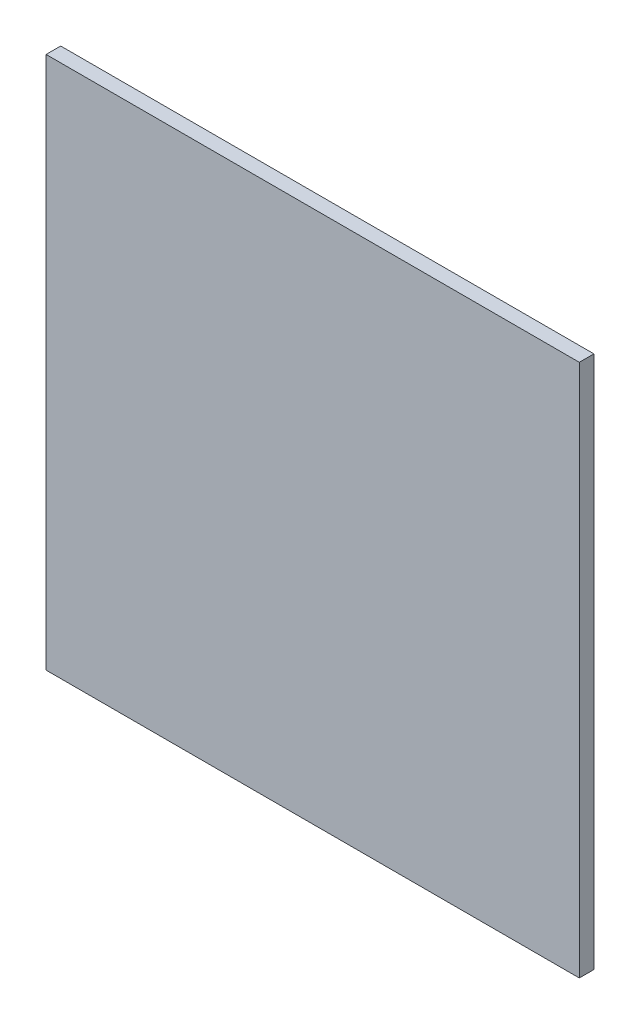
ISO-10303-21;
HEADER;
FILE_DESCRIPTION(('STEP AP214'),'2;1');
FILE_NAME('part.step','',(''),(''),'','','');
FILE_SCHEMA(('AUTOMOTIVE_DESIGN { 1 0 10303 214 1 1 1 1 }'));
ENDSEC;
DATA;
#1=APPLICATION_CONTEXT('core data for automotive mechanical design processes');
#2=APPLICATION_PROTOCOL_DEFINITION('international standard','automotive_design',2000,#1);
#3=PRODUCT_CONTEXT('',#1,'mechanical');
#4=PRODUCT('Part','Part','',(#3));
#5=PRODUCT_RELATED_PRODUCT_CATEGORY('part','',(#4));
#6=PRODUCT_DEFINITION_FORMATION('','',#4);
#7=PRODUCT_DEFINITION_CONTEXT('part definition',#1,'design');
#8=PRODUCT_DEFINITION('design','',#6,#7);
#9=PRODUCT_DEFINITION_SHAPE('','',#8);
#10=(LENGTH_UNIT() NAMED_UNIT(*) SI_UNIT(.MILLI.,.METRE.));
#11=(NAMED_UNIT(*) PLANE_ANGLE_UNIT() SI_UNIT($,.RADIAN.));
#12=(NAMED_UNIT(*) SI_UNIT($,.STERADIAN.) SOLID_ANGLE_UNIT());
#13=UNCERTAINTY_MEASURE_WITH_UNIT(LENGTH_MEASURE(1.E-05),#10,'distance_accuracy_value','');
#14=(GEOMETRIC_REPRESENTATION_CONTEXT(3) GLOBAL_UNCERTAINTY_ASSIGNED_CONTEXT((#13)) GLOBAL_UNIT_ASSIGNED_CONTEXT((#10,
#11,#12)) REPRESENTATION_CONTEXT('',''));
#15=CARTESIAN_POINT('',(0.,0.,0.));
#16=DIRECTION('',(0.,0.,1.));
#17=DIRECTION('',(1.,0.,0.));
#18=AXIS2_PLACEMENT_3D('',#15,#16,#17);
#19=CARTESIAN_POINT('',(36.5,36.5,2.));
#20=DIRECTION('',(-1.,0.,0.));
#21=DIRECTION('',(0.,-1.,0.));
#22=AXIS2_PLACEMENT_3D('',#19,#20,#21);
#23=PLANE('',#22);
#24=DIRECTION('',(0.,1.,0.));
#25=VECTOR('',#24,1.);
#26=CARTESIAN_POINT('',(36.5,36.5,0.));
#27=LINE('',#26,#25);
#28=CARTESIAN_POINT('',(36.5,-36.5,0.));
#29=VERTEX_POINT('',#28);
#30=CARTESIAN_POINT('',(36.5,36.5,0.));
#31=VERTEX_POINT('',#30);
#32=EDGE_CURVE('E96',#29,#31,#27,.T.);
#33=ORIENTED_EDGE('',*,*,#32,.T.);
#34=DIRECTION('',(0.,0.,-1.));
#35=VECTOR('',#34,1.);
#36=CARTESIAN_POINT('',(36.5,36.5,2.));
#37=LINE('',#36,#35);
#38=CARTESIAN_POINT('',(36.5,36.5,2.));
#39=VERTEX_POINT('',#38);
#40=EDGE_CURVE('E11',#39,#31,#37,.T.);
#41=ORIENTED_EDGE('',*,*,#40,.F.);
#42=DIRECTION('',(0.,1.,0.));
#43=VECTOR('',#42,1.);
#44=CARTESIAN_POINT('',(36.5,36.5,2.));
#45=LINE('',#44,#43);
#46=CARTESIAN_POINT('',(36.5,-36.5,2.));
#47=VERTEX_POINT('',#46);
#48=EDGE_CURVE('E84',#47,#39,#45,.T.);
#49=ORIENTED_EDGE('',*,*,#48,.F.);
#50=DIRECTION('',(0.,0.,-1.));
#51=VECTOR('',#50,1.);
#52=CARTESIAN_POINT('',(36.5,-36.5,2.));
#53=LINE('',#52,#51);
#54=EDGE_CURVE('E92',#47,#29,#53,.T.);
#55=ORIENTED_EDGE('',*,*,#54,.T.);
#56=EDGE_LOOP('',(#33,#41,#49,#55));
#57=FACE_BOUND('',#56,.T.);
#58=ADVANCED_FACE('F33',(#57),#23,.F.);
#59=CARTESIAN_POINT('',(-36.5,36.5,2.));
#60=DIRECTION('',(0.,-1.,0.));
#61=DIRECTION('',(0.,0.,-1.));
#62=AXIS2_PLACEMENT_3D('',#59,#60,#61);
#63=PLANE('',#62);
#64=DIRECTION('',(-1.,0.,0.));
#65=VECTOR('',#64,1.);
#66=CARTESIAN_POINT('',(-36.5,36.5,0.));
#67=LINE('',#66,#65);
#68=CARTESIAN_POINT('',(-36.5,36.5,0.));
#69=VERTEX_POINT('',#68);
#70=EDGE_CURVE('E88',#31,#69,#67,.T.);
#71=ORIENTED_EDGE('',*,*,#70,.T.);
#72=DIRECTION('',(0.,0.,-1.));
#73=VECTOR('',#72,1.);
#74=CARTESIAN_POINT('',(-36.5,36.5,2.));
#75=LINE('',#74,#73);
#76=CARTESIAN_POINT('',(-36.5,36.5,2.));
#77=VERTEX_POINT('',#76);
#78=EDGE_CURVE('E41',#77,#69,#75,.T.);
#79=ORIENTED_EDGE('',*,*,#78,.F.);
#80=DIRECTION('',(-1.,0.,0.));
#81=VECTOR('',#80,1.);
#82=CARTESIAN_POINT('',(-36.5,36.5,2.));
#83=LINE('',#82,#81);
#84=EDGE_CURVE('E79',#39,#77,#83,.T.);
#85=ORIENTED_EDGE('',*,*,#84,.F.);
#86=ORIENTED_EDGE('',*,*,#40,.T.);
#87=EDGE_LOOP('',(#71,#79,#85,#86));
#88=FACE_BOUND('',#87,.T.);
#89=ADVANCED_FACE('F87',(#88),#63,.F.);
#90=CARTESIAN_POINT('',(-36.5,36.5,2.));
#91=DIRECTION('',(1.,0.,0.));
#92=DIRECTION('',(0.,1.,0.));
#93=AXIS2_PLACEMENT_3D('',#90,#91,#92);
#94=PLANE('',#93);
#95=DIRECTION('',(0.,-1.,0.));
#96=VECTOR('',#95,1.);
#97=CARTESIAN_POINT('',(-36.5,36.5,0.));
#98=LINE('',#97,#96);
#99=CARTESIAN_POINT('',(-36.5,-36.5,0.));
#100=VERTEX_POINT('',#99);
#101=EDGE_CURVE('E66',#69,#100,#98,.T.);
#102=ORIENTED_EDGE('',*,*,#101,.T.);
#103=DIRECTION('',(0.,0.,-1.));
#104=VECTOR('',#103,1.);
#105=CARTESIAN_POINT('',(-36.5,-36.5,2.));
#106=LINE('',#105,#104);
#107=CARTESIAN_POINT('',(-36.5,-36.5,2.));
#108=VERTEX_POINT('',#107);
#109=EDGE_CURVE('E89',#108,#100,#106,.T.);
#110=ORIENTED_EDGE('',*,*,#109,.F.);
#111=DIRECTION('',(0.,-1.,0.));
#112=VECTOR('',#111,1.);
#113=CARTESIAN_POINT('',(-36.5,36.5,2.));
#114=LINE('',#113,#112);
#115=EDGE_CURVE('E82',#77,#108,#114,.T.);
#116=ORIENTED_EDGE('',*,*,#115,.F.);
#117=ORIENTED_EDGE('',*,*,#78,.T.);
#118=EDGE_LOOP('',(#102,#110,#116,#117));
#119=FACE_BOUND('',#118,.T.);
#120=ADVANCED_FACE('F90',(#119),#94,.F.);
#121=CARTESIAN_POINT('',(-36.5,-36.5,2.));
#122=DIRECTION('',(0.,1.,0.));
#123=DIRECTION('',(0.,0.,1.));
#124=AXIS2_PLACEMENT_3D('',#121,#122,#123);
#125=PLANE('',#124);
#126=DIRECTION('',(1.,0.,0.));
#127=VECTOR('',#126,1.);
#128=CARTESIAN_POINT('',(-36.5,-36.5,0.));
#129=LINE('',#128,#127);
#130=EDGE_CURVE('E72',#100,#29,#129,.T.);
#131=ORIENTED_EDGE('',*,*,#130,.T.);
#132=ORIENTED_EDGE('',*,*,#54,.F.);
#133=DIRECTION('',(1.,0.,0.));
#134=VECTOR('',#133,1.);
#135=CARTESIAN_POINT('',(-36.5,-36.5,2.));
#136=LINE('',#135,#134);
#137=EDGE_CURVE('E49',#108,#47,#136,.T.);
#138=ORIENTED_EDGE('',*,*,#137,.F.);
#139=ORIENTED_EDGE('',*,*,#109,.T.);
#140=EDGE_LOOP('',(#131,#132,#138,#139));
#141=FACE_BOUND('',#140,.T.);
#142=ADVANCED_FACE('F103',(#141),#125,.F.);
#143=CARTESIAN_POINT('',(0.,0.,2.));
#144=DIRECTION('',(0.,0.,1.));
#145=DIRECTION('',(1.,0.,0.));
#146=AXIS2_PLACEMENT_3D('',#143,#144,#145);
#147=PLANE('',#146);
#148=ORIENTED_EDGE('',*,*,#48,.T.);
#149=ORIENTED_EDGE('',*,*,#84,.T.);
#150=ORIENTED_EDGE('',*,*,#115,.T.);
#151=ORIENTED_EDGE('',*,*,#137,.T.);
#152=EDGE_LOOP('',(#148,#149,#150,#151));
#153=FACE_BOUND('',#152,.T.);
#154=ADVANCED_FACE('F80',(#153),#147,.T.);
#155=CARTESIAN_POINT('',(0.,0.,0.));
#156=DIRECTION('',(0.,0.,1.));
#157=DIRECTION('',(1.,0.,0.));
#158=AXIS2_PLACEMENT_3D('',#155,#156,#157);
#159=PLANE('',#158);
#160=ORIENTED_EDGE('',*,*,#32,.F.);
#161=ORIENTED_EDGE('',*,*,#130,.F.);
#162=ORIENTED_EDGE('',*,*,#101,.F.);
#163=ORIENTED_EDGE('',*,*,#70,.F.);
#164=EDGE_LOOP('',(#160,#161,#162,#163));
#165=FACE_BOUND('',#164,.T.);
#166=ADVANCED_FACE('F106',(#165),#159,.F.);
#167=CLOSED_SHELL('',(#58,#89,#120,#142,#154,#166));
#168=MANIFOLD_SOLID_BREP('B2',#167);
#169=ADVANCED_BREP_SHAPE_REPRESENTATION('',(#18,#168),#14);
#170=SHAPE_DEFINITION_REPRESENTATION(#9,#169);
ENDSEC;
END-ISO-10303-21;
